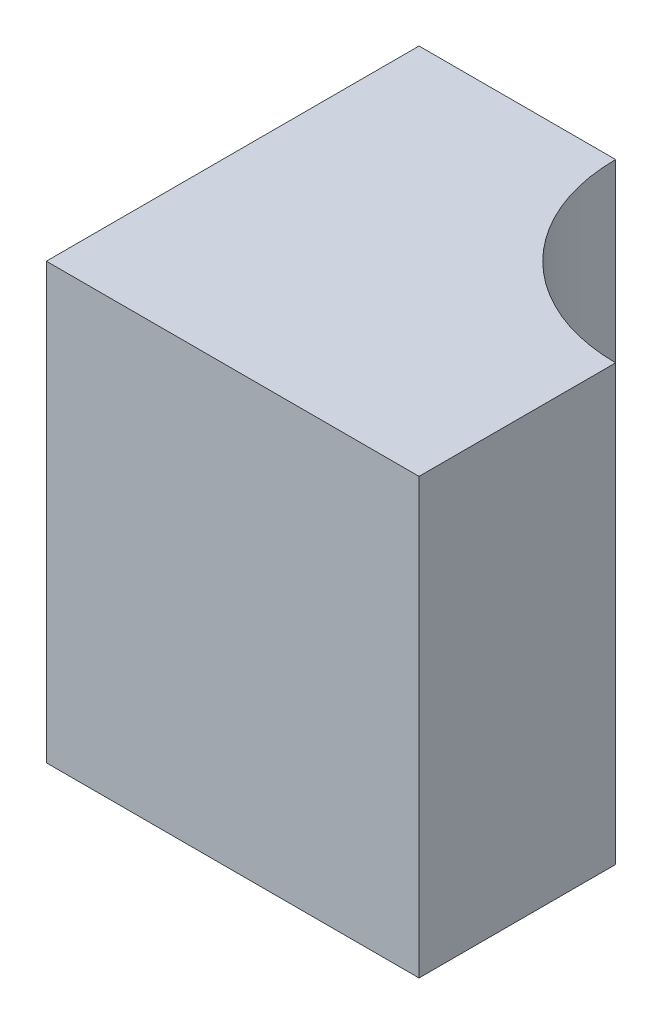
ISO-10303-21;
HEADER;
FILE_DESCRIPTION(('STEP AP214'),'2;1');
FILE_NAME('part.step','',(''),(''),'','','');
FILE_SCHEMA(('AUTOMOTIVE_DESIGN { 1 0 10303 214 1 1 1 1 }'));
ENDSEC;
DATA;
#1=APPLICATION_CONTEXT('core data for automotive mechanical design processes');
#2=APPLICATION_PROTOCOL_DEFINITION('international standard','automotive_design',2000,#1);
#3=PRODUCT_CONTEXT('',#1,'mechanical');
#4=PRODUCT('Part','Part','',(#3));
#5=PRODUCT_RELATED_PRODUCT_CATEGORY('part','',(#4));
#6=PRODUCT_DEFINITION_FORMATION('','',#4);
#7=PRODUCT_DEFINITION_CONTEXT('part definition',#1,'design');
#8=PRODUCT_DEFINITION('design','',#6,#7);
#9=PRODUCT_DEFINITION_SHAPE('','',#8);
#10=(LENGTH_UNIT() NAMED_UNIT(*) SI_UNIT(.MILLI.,.METRE.));
#11=(NAMED_UNIT(*) PLANE_ANGLE_UNIT() SI_UNIT($,.RADIAN.));
#12=(NAMED_UNIT(*) SI_UNIT($,.STERADIAN.) SOLID_ANGLE_UNIT());
#13=UNCERTAINTY_MEASURE_WITH_UNIT(LENGTH_MEASURE(1.E-05),#10,'distance_accuracy_value','');
#14=(GEOMETRIC_REPRESENTATION_CONTEXT(3) GLOBAL_UNCERTAINTY_ASSIGNED_CONTEXT((#13)) GLOBAL_UNIT_ASSIGNED_CONTEXT((#10,
#11,#12)) REPRESENTATION_CONTEXT('',''));
#15=CARTESIAN_POINT('',(0.,0.,0.));
#16=DIRECTION('',(0.,0.,1.));
#17=DIRECTION('',(1.,0.,0.));
#18=AXIS2_PLACEMENT_3D('',#15,#16,#17);
#19=CARTESIAN_POINT('',(0.199999999999998,19.,-16.5));
#20=DIRECTION('',(1.,0.,0.));
#21=DIRECTION('',(0.,0.,-1.));
#22=AXIS2_PLACEMENT_3D('',#19,#20,#21);
#23=PLANE('',#22);
#24=DIRECTION('',(0.,0.,1.));
#25=VECTOR('',#24,1.);
#26=CARTESIAN_POINT('',(0.199999999999998,0.,-16.5));
#27=LINE('',#26,#25);
#28=CARTESIAN_POINT('',(0.199999999999998,0.,-16.5));
#29=VERTEX_POINT('',#28);
#30=CARTESIAN_POINT('',(0.200000000000002,0.,-0.2));
#31=VERTEX_POINT('',#30);
#32=EDGE_CURVE('E110',#29,#31,#27,.T.);
#33=ORIENTED_EDGE('',*,*,#32,.T.);
#34=DIRECTION('',(0.,-1.,0.));
#35=VECTOR('',#34,1.);
#36=CARTESIAN_POINT('',(0.200000000000002,19.,-0.2));
#37=LINE('',#36,#35);
#38=CARTESIAN_POINT('',(0.200000000000002,19.,-0.2));
#39=VERTEX_POINT('',#38);
#40=EDGE_CURVE('E11',#39,#31,#37,.T.);
#41=ORIENTED_EDGE('',*,*,#40,.F.);
#42=DIRECTION('',(0.,0.,1.));
#43=VECTOR('',#42,1.);
#44=CARTESIAN_POINT('',(0.199999999999998,19.,-16.5));
#45=LINE('',#44,#43);
#46=CARTESIAN_POINT('',(0.199999999999998,19.,-16.5));
#47=VERTEX_POINT('',#46);
#48=EDGE_CURVE('E118',#47,#39,#45,.T.);
#49=ORIENTED_EDGE('',*,*,#48,.F.);
#50=DIRECTION('',(0.,-1.,0.));
#51=VECTOR('',#50,1.);
#52=CARTESIAN_POINT('',(0.199999999999998,19.,-16.5));
#53=LINE('',#52,#51);
#54=EDGE_CURVE('E106',#47,#29,#53,.T.);
#55=ORIENTED_EDGE('',*,*,#54,.T.);
#56=EDGE_LOOP('',(#33,#41,#49,#55));
#57=FACE_BOUND('',#56,.T.);
#58=ADVANCED_FACE('F36',(#57),#23,.F.);
#59=CARTESIAN_POINT('',(16.5,19.,-0.200000000000002));
#60=DIRECTION('',(0.,0.,-1.));
#61=DIRECTION('',(-1.,0.,0.));
#62=AXIS2_PLACEMENT_3D('',#59,#60,#61);
#63=PLANE('',#62);
#64=DIRECTION('',(1.,0.,0.));
#65=VECTOR('',#64,1.);
#66=CARTESIAN_POINT('',(16.5,0.,-0.200000000000002));
#67=LINE('',#66,#65);
#68=CARTESIAN_POINT('',(16.5,0.,-0.200000000000002));
#69=VERTEX_POINT('',#68);
#70=EDGE_CURVE('E113',#31,#69,#67,.T.);
#71=ORIENTED_EDGE('',*,*,#70,.T.);
#72=DIRECTION('',(0.,-1.,0.));
#73=VECTOR('',#72,1.);
#74=CARTESIAN_POINT('',(16.5,19.,-0.200000000000002));
#75=LINE('',#74,#73);
#76=CARTESIAN_POINT('',(16.5,19.,-0.200000000000002));
#77=VERTEX_POINT('',#76);
#78=EDGE_CURVE('E44',#77,#69,#75,.T.);
#79=ORIENTED_EDGE('',*,*,#78,.F.);
#80=DIRECTION('',(1.,0.,0.));
#81=VECTOR('',#80,1.);
#82=CARTESIAN_POINT('',(16.5,19.,-0.200000000000002));
#83=LINE('',#82,#81);
#84=EDGE_CURVE('E86',#39,#77,#83,.T.);
#85=ORIENTED_EDGE('',*,*,#84,.F.);
#86=ORIENTED_EDGE('',*,*,#40,.T.);
#87=EDGE_LOOP('',(#71,#79,#85,#86));
#88=FACE_BOUND('',#87,.T.);
#89=ADVANCED_FACE('F137',(#88),#63,.F.);
#90=CARTESIAN_POINT('',(16.5,19.,-8.8));
#91=DIRECTION('',(-1.,0.,0.));
#92=DIRECTION('',(0.,0.,1.));
#93=AXIS2_PLACEMENT_3D('',#90,#91,#92);
#94=PLANE('',#93);
#95=DIRECTION('',(0.,0.,-1.));
#96=VECTOR('',#95,1.);
#97=CARTESIAN_POINT('',(16.5,0.,-8.8));
#98=LINE('',#97,#96);
#99=CARTESIAN_POINT('',(16.5,0.,-8.8));
#100=VERTEX_POINT('',#99);
#101=EDGE_CURVE('E101',#69,#100,#98,.T.);
#102=ORIENTED_EDGE('',*,*,#101,.T.);
#103=DIRECTION('',(0.,-1.,0.));
#104=VECTOR('',#103,1.);
#105=CARTESIAN_POINT('',(16.5,19.,-8.8));
#106=LINE('',#105,#104);
#107=CARTESIAN_POINT('',(16.5,19.,-8.8));
#108=VERTEX_POINT('',#107);
#109=EDGE_CURVE('E98',#108,#100,#106,.T.);
#110=ORIENTED_EDGE('',*,*,#109,.F.);
#111=DIRECTION('',(0.,0.,-1.));
#112=VECTOR('',#111,1.);
#113=CARTESIAN_POINT('',(16.5,19.,-8.8));
#114=LINE('',#113,#112);
#115=EDGE_CURVE('E90',#77,#108,#114,.T.);
#116=ORIENTED_EDGE('',*,*,#115,.F.);
#117=ORIENTED_EDGE('',*,*,#78,.T.);
#118=EDGE_LOOP('',(#102,#110,#116,#117));
#119=FACE_BOUND('',#118,.T.);
#120=ADVANCED_FACE('F99',(#119),#94,.F.);
#121=CARTESIAN_POINT('',(16.5,19.,-16.5));
#122=DIRECTION('',(0.,-1.,0.));
#123=DIRECTION('',(0.,0.,-1.));
#124=AXIS2_PLACEMENT_3D('',#121,#122,#123);
#125=CYLINDRICAL_SURFACE('',#124,7.7);
#126=CARTESIAN_POINT('',(16.5,0.,-16.5));
#127=DIRECTION('',(0.,-1.,0.));
#128=DIRECTION('',(0.,0.,1.));
#129=AXIS2_PLACEMENT_3D('',#126,#127,#128);
#130=CIRCLE('',#129,7.7);
#131=CARTESIAN_POINT('',(8.8,0.,-16.5));
#132=VERTEX_POINT('',#131);
#133=EDGE_CURVE('E72',#100,#132,#130,.T.);
#134=ORIENTED_EDGE('',*,*,#133,.T.);
#135=DIRECTION('',(0.,-1.,0.));
#136=VECTOR('',#135,1.);
#137=CARTESIAN_POINT('',(8.8,19.,-16.5));
#138=LINE('',#137,#136);
#139=CARTESIAN_POINT('',(8.8,19.,-16.5));
#140=VERTEX_POINT('',#139);
#141=EDGE_CURVE('E102',#140,#132,#138,.T.);
#142=ORIENTED_EDGE('',*,*,#141,.F.);
#143=CARTESIAN_POINT('',(16.5,19.,-16.5));
#144=DIRECTION('',(0.,-1.,0.));
#145=DIRECTION('',(0.,0.,1.));
#146=AXIS2_PLACEMENT_3D('',#143,#144,#145);
#147=CIRCLE('',#146,7.7);
#148=EDGE_CURVE('E94',#108,#140,#147,.T.);
#149=ORIENTED_EDGE('',*,*,#148,.F.);
#150=ORIENTED_EDGE('',*,*,#109,.T.);
#151=EDGE_LOOP('',(#134,#142,#149,#150));
#152=FACE_BOUND('',#151,.T.);
#153=ADVANCED_FACE('F104',(#152),#125,.F.);
#154=CARTESIAN_POINT('',(8.8,19.,-16.5));
#155=DIRECTION('',(0.,0.,1.));
#156=DIRECTION('',(1.,0.,0.));
#157=AXIS2_PLACEMENT_3D('',#154,#155,#156);
#158=PLANE('',#157);
#159=DIRECTION('',(-1.,0.,0.));
#160=VECTOR('',#159,1.);
#161=CARTESIAN_POINT('',(8.8,0.,-16.5));
#162=LINE('',#161,#160);
#163=EDGE_CURVE('E78',#132,#29,#162,.T.);
#164=ORIENTED_EDGE('',*,*,#163,.T.);
#165=ORIENTED_EDGE('',*,*,#54,.F.);
#166=DIRECTION('',(-1.,0.,0.));
#167=VECTOR('',#166,1.);
#168=CARTESIAN_POINT('',(8.8,19.,-16.5));
#169=LINE('',#168,#167);
#170=EDGE_CURVE('E52',#140,#47,#169,.T.);
#171=ORIENTED_EDGE('',*,*,#170,.F.);
#172=ORIENTED_EDGE('',*,*,#141,.T.);
#173=EDGE_LOOP('',(#164,#165,#171,#172));
#174=FACE_BOUND('',#173,.T.);
#175=ADVANCED_FACE('F126',(#174),#158,.F.);
#176=CARTESIAN_POINT('',(16.5,19.,-16.5));
#177=DIRECTION('',(0.,1.,0.));
#178=DIRECTION('',(0.,0.,1.));
#179=AXIS2_PLACEMENT_3D('',#176,#177,#178);
#180=PLANE('',#179);
#181=ORIENTED_EDGE('',*,*,#48,.T.);
#182=ORIENTED_EDGE('',*,*,#84,.T.);
#183=ORIENTED_EDGE('',*,*,#115,.T.);
#184=ORIENTED_EDGE('',*,*,#148,.T.);
#185=ORIENTED_EDGE('',*,*,#170,.T.);
#186=EDGE_LOOP('',(#181,#182,#183,#184,#185));
#187=FACE_BOUND('',#186,.T.);
#188=ADVANCED_FACE('F92',(#187),#180,.T.);
#189=CARTESIAN_POINT('',(16.5,0.,-16.5));
#190=DIRECTION('',(0.,1.,0.));
#191=DIRECTION('',(0.,0.,1.));
#192=AXIS2_PLACEMENT_3D('',#189,#190,#191);
#193=PLANE('',#192);
#194=ORIENTED_EDGE('',*,*,#32,.F.);
#195=ORIENTED_EDGE('',*,*,#163,.F.);
#196=ORIENTED_EDGE('',*,*,#133,.F.);
#197=ORIENTED_EDGE('',*,*,#101,.F.);
#198=ORIENTED_EDGE('',*,*,#70,.F.);
#199=EDGE_LOOP('',(#194,#195,#196,#197,#198));
#200=FACE_BOUND('',#199,.T.);
#201=ADVANCED_FACE('F122',(#200),#193,.F.);
#202=CLOSED_SHELL('',(#58,#89,#120,#153,#175,#188,#201));
#203=MANIFOLD_SOLID_BREP('B2',#202);
#204=ADVANCED_BREP_SHAPE_REPRESENTATION('',(#18,#203),#14);
#205=SHAPE_DEFINITION_REPRESENTATION(#9,#204);
ENDSEC;
END-ISO-10303-21;
